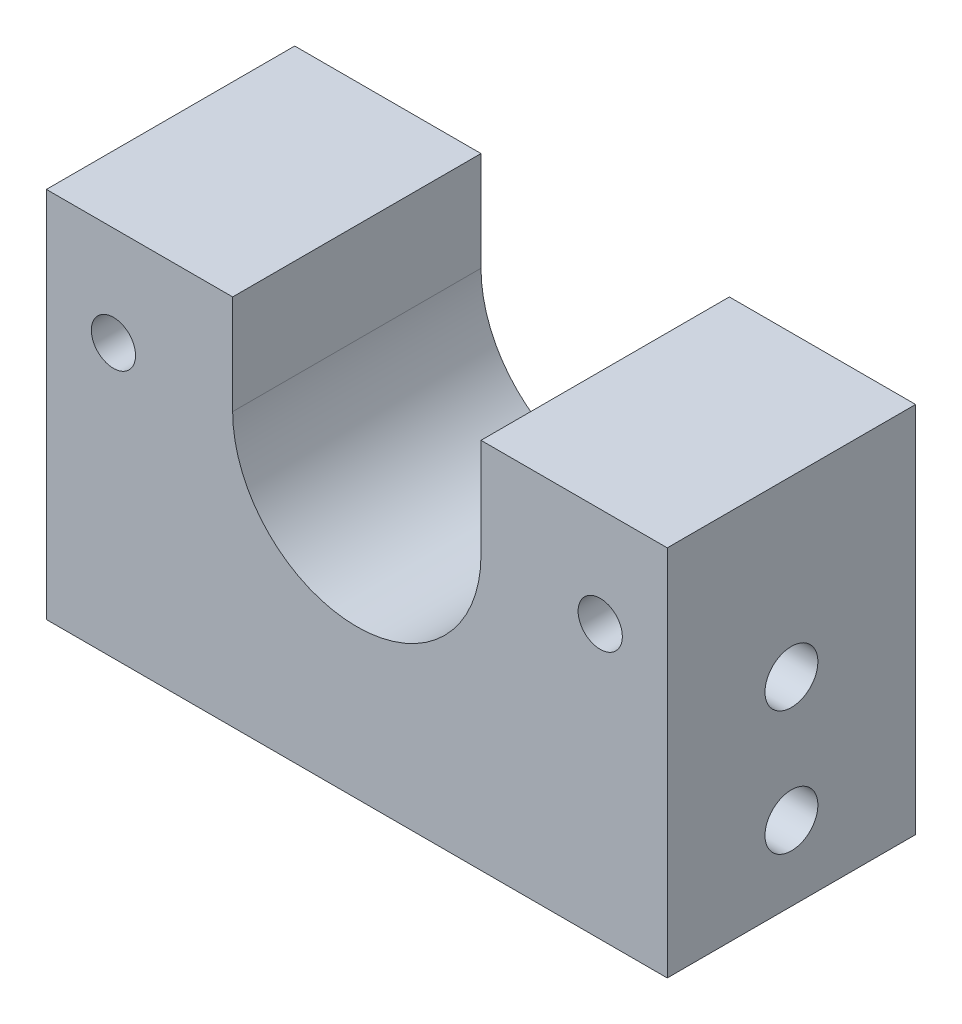
ISO-10303-21;
HEADER;
FILE_DESCRIPTION(('STEP AP214'),'2;1');
FILE_NAME('part.step','',(''),(''),'','','');
FILE_SCHEMA(('AUTOMOTIVE_DESIGN { 1 0 10303 214 1 1 1 1 }'));
ENDSEC;
DATA;
#1=APPLICATION_CONTEXT('core data for automotive mechanical design processes');
#2=APPLICATION_PROTOCOL_DEFINITION('international standard','automotive_design',2000,#1);
#3=PRODUCT_CONTEXT('',#1,'mechanical');
#4=PRODUCT('Part','Part','',(#3));
#5=PRODUCT_RELATED_PRODUCT_CATEGORY('part','',(#4));
#6=PRODUCT_DEFINITION_FORMATION('','',#4);
#7=PRODUCT_DEFINITION_CONTEXT('part definition',#1,'design');
#8=PRODUCT_DEFINITION('design','',#6,#7);
#9=PRODUCT_DEFINITION_SHAPE('','',#8);
#10=(LENGTH_UNIT() NAMED_UNIT(*) SI_UNIT(.MILLI.,.METRE.));
#11=(NAMED_UNIT(*) PLANE_ANGLE_UNIT() SI_UNIT($,.RADIAN.));
#12=(NAMED_UNIT(*) SI_UNIT($,.STERADIAN.) SOLID_ANGLE_UNIT());
#13=UNCERTAINTY_MEASURE_WITH_UNIT(LENGTH_MEASURE(1.E-05),#10,'distance_accuracy_value','');
#14=(GEOMETRIC_REPRESENTATION_CONTEXT(3) GLOBAL_UNCERTAINTY_ASSIGNED_CONTEXT((#13)) GLOBAL_UNIT_ASSIGNED_CONTEXT((#10,
#11,#12)) REPRESENTATION_CONTEXT('',''));
#15=CARTESIAN_POINT('',(0.,0.,0.));
#16=DIRECTION('',(0.,0.,1.));
#17=DIRECTION('',(1.,0.,0.));
#18=AXIS2_PLACEMENT_3D('',#15,#16,#17);
#19=CARTESIAN_POINT('',(-31.75,19.05,0.));
#20=DIRECTION('',(0.,1.,0.));
#21=DIRECTION('',(0.,0.,1.));
#22=AXIS2_PLACEMENT_3D('',#19,#20,#21);
#23=PLANE('',#22);
#24=DIRECTION('',(0.,0.,-1.));
#25=VECTOR('',#24,1.);
#26=CARTESIAN_POINT('',(-22.225,19.05,0.));
#27=LINE('',#26,#25);
#28=CARTESIAN_POINT('',(-22.225,19.05,0.));
#29=VERTEX_POINT('',#28);
#30=CARTESIAN_POINT('',(-22.225,19.05,-12.7));
#31=VERTEX_POINT('',#30);
#32=EDGE_CURVE('E163',#29,#31,#27,.T.);
#33=ORIENTED_EDGE('',*,*,#32,.T.);
#34=DIRECTION('',(1.,0.,0.));
#35=VECTOR('',#34,1.);
#36=CARTESIAN_POINT('',(-31.75,19.05,-12.7));
#37=LINE('',#36,#35);
#38=CARTESIAN_POINT('',(-31.75,19.05,-12.7));
#39=VERTEX_POINT('',#38);
#40=EDGE_CURVE('E193',#39,#31,#37,.T.);
#41=ORIENTED_EDGE('',*,*,#40,.F.);
#42=DIRECTION('',(0.,0.,1.));
#43=VECTOR('',#42,1.);
#44=CARTESIAN_POINT('',(-31.75,19.05,0.));
#45=LINE('',#44,#43);
#46=CARTESIAN_POINT('',(-31.75,19.05,0.));
#47=VERTEX_POINT('',#46);
#48=EDGE_CURVE('E180',#39,#47,#45,.T.);
#49=ORIENTED_EDGE('',*,*,#48,.T.);
#50=DIRECTION('',(1.,0.,0.));
#51=VECTOR('',#50,1.);
#52=CARTESIAN_POINT('',(-31.75,19.05,0.));
#53=LINE('',#52,#51);
#54=EDGE_CURVE('E11',#47,#29,#53,.T.);
#55=ORIENTED_EDGE('',*,*,#54,.T.);
#56=EDGE_LOOP('',(#33,#41,#49,#55));
#57=FACE_BOUND('',#56,.T.);
#58=ADVANCED_FACE('F35',(#57),#23,.T.);
#59=CARTESIAN_POINT('',(-31.75,0.,0.));
#60=DIRECTION('',(0.,0.,1.));
#61=DIRECTION('',(1.,0.,0.));
#62=AXIS2_PLACEMENT_3D('',#59,#60,#61);
#63=PLANE('',#62);
#64=CARTESIAN_POINT('',(-3.429,13.97,0.));
#65=DIRECTION('',(0.,0.,-1.));
#66=DIRECTION('',(-1.,0.,0.));
#67=AXIS2_PLACEMENT_3D('',#64,#65,#66);
#68=CIRCLE('',#67,1.1303);
#69=CARTESIAN_POINT('',(-4.5593,13.97,0.));
#70=VERTEX_POINT('',#69);
#71=EDGE_CURVE('E139',#70,#70,#68,.T.);
#72=ORIENTED_EDGE('',*,*,#71,.T.);
#73=EDGE_LOOP('',(#72));
#74=FACE_BOUND('',#73,.T.);
#75=CARTESIAN_POINT('',(-28.321,13.97,0.));
#76=DIRECTION('',(0.,0.,-1.));
#77=DIRECTION('',(-1.,0.,0.));
#78=AXIS2_PLACEMENT_3D('',#75,#76,#77);
#79=CIRCLE('',#78,1.1303);
#80=CARTESIAN_POINT('',(-29.4513,13.97,0.));
#81=VERTEX_POINT('',#80);
#82=EDGE_CURVE('E145',#81,#81,#79,.T.);
#83=ORIENTED_EDGE('',*,*,#82,.T.);
#84=EDGE_LOOP('',(#83));
#85=FACE_BOUND('',#84,.T.);
#86=DIRECTION('',(0.,1.,0.));
#87=VECTOR('',#86,1.);
#88=CARTESIAN_POINT('',(-22.225,19.05,0.));
#89=LINE('',#88,#87);
#90=CARTESIAN_POINT('',(-22.225,13.97,0.));
#91=VERTEX_POINT('',#90);
#92=EDGE_CURVE('E156',#91,#29,#89,.T.);
#93=ORIENTED_EDGE('',*,*,#92,.T.);
#94=ORIENTED_EDGE('',*,*,#54,.F.);
#95=DIRECTION('',(0.,-1.,0.));
#96=VECTOR('',#95,1.);
#97=CARTESIAN_POINT('',(-31.75,0.,0.));
#98=LINE('',#97,#96);
#99=CARTESIAN_POINT('',(-31.75,0.,0.));
#100=VERTEX_POINT('',#99);
#101=EDGE_CURVE('E172',#47,#100,#98,.T.);
#102=ORIENTED_EDGE('',*,*,#101,.T.);
#103=DIRECTION('',(1.,0.,0.));
#104=VECTOR('',#103,1.);
#105=CARTESIAN_POINT('',(-31.75,0.,0.));
#106=LINE('',#105,#104);
#107=CARTESIAN_POINT('',(0.,0.,0.));
#108=VERTEX_POINT('',#107);
#109=EDGE_CURVE('E39',#100,#108,#106,.T.);
#110=ORIENTED_EDGE('',*,*,#109,.T.);
#111=DIRECTION('',(0.,-1.,0.));
#112=VECTOR('',#111,1.);
#113=CARTESIAN_POINT('',(0.,0.,0.));
#114=LINE('',#113,#112);
#115=CARTESIAN_POINT('',(0.,19.05,0.));
#116=VERTEX_POINT('',#115);
#117=EDGE_CURVE('E166',#116,#108,#114,.T.);
#118=ORIENTED_EDGE('',*,*,#117,.F.);
#119=CARTESIAN_POINT('',(-9.525,19.05,0.));
#120=VERTEX_POINT('',#119);
#121=EDGE_CURVE('E44',#120,#116,#53,.T.);
#122=ORIENTED_EDGE('',*,*,#121,.F.);
#123=DIRECTION('',(0.,-1.,0.));
#124=VECTOR('',#123,1.);
#125=CARTESIAN_POINT('',(-9.525,19.05,0.));
#126=LINE('',#125,#124);
#127=CARTESIAN_POINT('',(-9.525,13.97,0.));
#128=VERTEX_POINT('',#127);
#129=EDGE_CURVE('E149',#120,#128,#126,.T.);
#130=ORIENTED_EDGE('',*,*,#129,.T.);
#131=CARTESIAN_POINT('',(-15.875,13.97,0.));
#132=DIRECTION('',(0.,0.,-1.));
#133=DIRECTION('',(-1.,0.,0.));
#134=AXIS2_PLACEMENT_3D('',#131,#132,#133);
#135=CIRCLE('',#134,6.35);
#136=EDGE_CURVE('E152',#128,#91,#135,.T.);
#137=ORIENTED_EDGE('',*,*,#136,.T.);
#138=EDGE_LOOP('',(#93,#94,#102,#110,#118,#122,#130,#137));
#139=FACE_BOUND('',#138,.T.);
#140=ADVANCED_FACE('F37',(#74,#85,#139),#63,.T.);
#141=DIRECTION('',(0.,0.,-1.));
#142=VECTOR('',#141,1.);
#143=CARTESIAN_POINT('',(-9.525,19.05,0.));
#144=LINE('',#143,#142);
#145=CARTESIAN_POINT('',(-9.525,19.05,-12.7));
#146=VERTEX_POINT('',#145);
#147=EDGE_CURVE('E52',#120,#146,#144,.T.);
#148=ORIENTED_EDGE('',*,*,#147,.F.);
#149=ORIENTED_EDGE('',*,*,#121,.T.);
#150=DIRECTION('',(0.,0.,1.));
#151=VECTOR('',#150,1.);
#152=CARTESIAN_POINT('',(0.,19.05,0.));
#153=LINE('',#152,#151);
#154=CARTESIAN_POINT('',(0.,19.05,-12.7));
#155=VERTEX_POINT('',#154);
#156=EDGE_CURVE('E175',#155,#116,#153,.T.);
#157=ORIENTED_EDGE('',*,*,#156,.F.);
#158=EDGE_CURVE('E195',#146,#155,#37,.T.);
#159=ORIENTED_EDGE('',*,*,#158,.F.);
#160=EDGE_LOOP('',(#148,#149,#157,#159));
#161=FACE_BOUND('',#160,.T.);
#162=ADVANCED_FACE('F202',(#161),#23,.T.);
#163=CARTESIAN_POINT('',(-31.75,0.,-12.7));
#164=DIRECTION('',(0.,0.,-1.));
#165=DIRECTION('',(-1.,0.,0.));
#166=AXIS2_PLACEMENT_3D('',#163,#164,#165);
#167=PLANE('',#166);
#168=CARTESIAN_POINT('',(-3.429,13.97,-12.7));
#169=DIRECTION('',(0.,0.,-1.));
#170=DIRECTION('',(-1.,0.,0.));
#171=AXIS2_PLACEMENT_3D('',#168,#169,#170);
#172=CIRCLE('',#171,1.1303);
#173=CARTESIAN_POINT('',(-4.5593,13.97,-12.7));
#174=VERTEX_POINT('',#173);
#175=EDGE_CURVE('E136',#174,#174,#172,.T.);
#176=ORIENTED_EDGE('',*,*,#175,.F.);
#177=EDGE_LOOP('',(#176));
#178=FACE_BOUND('',#177,.T.);
#179=CARTESIAN_POINT('',(-28.321,13.97,-12.7));
#180=DIRECTION('',(0.,0.,-1.));
#181=DIRECTION('',(-1.,0.,0.));
#182=AXIS2_PLACEMENT_3D('',#179,#180,#181);
#183=CIRCLE('',#182,1.1303);
#184=CARTESIAN_POINT('',(-29.4513,13.97,-12.7));
#185=VERTEX_POINT('',#184);
#186=EDGE_CURVE('E142',#185,#185,#183,.T.);
#187=ORIENTED_EDGE('',*,*,#186,.F.);
#188=EDGE_LOOP('',(#187));
#189=FACE_BOUND('',#188,.T.);
#190=DIRECTION('',(0.,1.,0.));
#191=VECTOR('',#190,1.);
#192=CARTESIAN_POINT('',(-22.225,19.05,-12.7));
#193=LINE('',#192,#191);
#194=CARTESIAN_POINT('',(-22.225,13.97,-12.7));
#195=VERTEX_POINT('',#194);
#196=EDGE_CURVE('E153',#195,#31,#193,.T.);
#197=ORIENTED_EDGE('',*,*,#196,.F.);
#198=CARTESIAN_POINT('',(-15.875,13.97,-12.7));
#199=DIRECTION('',(0.,0.,-1.));
#200=DIRECTION('',(-1.,0.,0.));
#201=AXIS2_PLACEMENT_3D('',#198,#199,#200);
#202=CIRCLE('',#201,6.35);
#203=CARTESIAN_POINT('',(-9.525,13.97,-12.7));
#204=VERTEX_POINT('',#203);
#205=EDGE_CURVE('E159',#204,#195,#202,.T.);
#206=ORIENTED_EDGE('',*,*,#205,.F.);
#207=DIRECTION('',(0.,-1.,0.));
#208=VECTOR('',#207,1.);
#209=CARTESIAN_POINT('',(-9.525,19.05,-12.7));
#210=LINE('',#209,#208);
#211=EDGE_CURVE('E148',#146,#204,#210,.T.);
#212=ORIENTED_EDGE('',*,*,#211,.F.);
#213=ORIENTED_EDGE('',*,*,#158,.T.);
#214=DIRECTION('',(0.,1.,0.));
#215=VECTOR('',#214,1.);
#216=CARTESIAN_POINT('',(0.,0.,-12.7));
#217=LINE('',#216,#215);
#218=CARTESIAN_POINT('',(0.,0.,-12.7));
#219=VERTEX_POINT('',#218);
#220=EDGE_CURVE('E188',#219,#155,#217,.T.);
#221=ORIENTED_EDGE('',*,*,#220,.F.);
#222=DIRECTION('',(1.,0.,0.));
#223=VECTOR('',#222,1.);
#224=CARTESIAN_POINT('',(-31.75,0.,-12.7));
#225=LINE('',#224,#223);
#226=CARTESIAN_POINT('',(-31.75,0.,-12.7));
#227=VERTEX_POINT('',#226);
#228=EDGE_CURVE('E196',#227,#219,#225,.T.);
#229=ORIENTED_EDGE('',*,*,#228,.F.);
#230=DIRECTION('',(0.,1.,0.));
#231=VECTOR('',#230,1.);
#232=CARTESIAN_POINT('',(-31.75,0.,-12.7));
#233=LINE('',#232,#231);
#234=EDGE_CURVE('E177',#227,#39,#233,.T.);
#235=ORIENTED_EDGE('',*,*,#234,.T.);
#236=ORIENTED_EDGE('',*,*,#40,.T.);
#237=EDGE_LOOP('',(#197,#206,#212,#213,#221,#229,#235,#236));
#238=FACE_BOUND('',#237,.T.);
#239=ADVANCED_FACE('F205',(#178,#189,#238),#167,.T.);
#240=CARTESIAN_POINT('',(-31.75,0.,0.));
#241=DIRECTION('',(0.,-1.,0.));
#242=DIRECTION('',(0.,0.,-1.));
#243=AXIS2_PLACEMENT_3D('',#240,#241,#242);
#244=PLANE('',#243);
#245=DIRECTION('',(0.,0.,-1.));
#246=VECTOR('',#245,1.);
#247=CARTESIAN_POINT('',(0.,0.,0.));
#248=LINE('',#247,#246);
#249=EDGE_CURVE('E185',#108,#219,#248,.T.);
#250=ORIENTED_EDGE('',*,*,#249,.F.);
#251=ORIENTED_EDGE('',*,*,#109,.F.);
#252=DIRECTION('',(0.,0.,-1.));
#253=VECTOR('',#252,1.);
#254=CARTESIAN_POINT('',(-31.75,0.,0.));
#255=LINE('',#254,#253);
#256=EDGE_CURVE('E174',#100,#227,#255,.T.);
#257=ORIENTED_EDGE('',*,*,#256,.T.);
#258=ORIENTED_EDGE('',*,*,#228,.T.);
#259=EDGE_LOOP('',(#250,#251,#257,#258));
#260=FACE_BOUND('',#259,.T.);
#261=ADVANCED_FACE('F198',(#260),#244,.T.);
#262=CARTESIAN_POINT('',(-31.75,0.,0.));
#263=DIRECTION('',(-1.,0.,0.));
#264=DIRECTION('',(0.,0.,1.));
#265=AXIS2_PLACEMENT_3D('',#262,#263,#264);
#266=PLANE('',#265);
#267=ORIENTED_EDGE('',*,*,#101,.F.);
#268=ORIENTED_EDGE('',*,*,#48,.F.);
#269=ORIENTED_EDGE('',*,*,#234,.F.);
#270=ORIENTED_EDGE('',*,*,#256,.F.);
#271=EDGE_LOOP('',(#267,#268,#269,#270));
#272=FACE_BOUND('',#271,.T.);
#273=ADVANCED_FACE('F217',(#272),#266,.T.);
#274=CARTESIAN_POINT('',(0.,0.,0.));
#275=DIRECTION('',(-1.,0.,0.));
#276=DIRECTION('',(0.,0.,1.));
#277=AXIS2_PLACEMENT_3D('',#274,#275,#276);
#278=PLANE('',#277);
#279=CARTESIAN_POINT('',(0.,3.81,-6.35));
#280=DIRECTION('',(1.,0.,0.));
#281=DIRECTION('',(0.,0.,-1.));
#282=AXIS2_PLACEMENT_3D('',#279,#280,#281);
#283=CIRCLE('',#282,1.35254999999999);
#284=CARTESIAN_POINT('',(0.,3.81,-7.70254999999999));
#285=VERTEX_POINT('',#284);
#286=EDGE_CURVE('E126',#285,#285,#283,.T.);
#287=ORIENTED_EDGE('',*,*,#286,.F.);
#288=EDGE_LOOP('',(#287));
#289=FACE_BOUND('',#288,.T.);
#290=CARTESIAN_POINT('',(0.,10.16,-6.35));
#291=DIRECTION('',(1.,0.,0.));
#292=DIRECTION('',(0.,0.,-1.));
#293=AXIS2_PLACEMENT_3D('',#290,#291,#292);
#294=CIRCLE('',#293,1.35254999999999);
#295=CARTESIAN_POINT('',(0.,10.16,-7.70254999999999));
#296=VERTEX_POINT('',#295);
#297=EDGE_CURVE('E125',#296,#296,#294,.T.);
#298=ORIENTED_EDGE('',*,*,#297,.F.);
#299=EDGE_LOOP('',(#298));
#300=FACE_BOUND('',#299,.T.);
#301=ORIENTED_EDGE('',*,*,#117,.T.);
#302=ORIENTED_EDGE('',*,*,#249,.T.);
#303=ORIENTED_EDGE('',*,*,#220,.T.);
#304=ORIENTED_EDGE('',*,*,#156,.T.);
#305=EDGE_LOOP('',(#301,#302,#303,#304));
#306=FACE_BOUND('',#305,.T.);
#307=ADVANCED_FACE('F200',(#289,#300,#306),#278,.F.);
#308=CARTESIAN_POINT('',(-22.225,19.05,0.));
#309=DIRECTION('',(-1.,0.,0.));
#310=DIRECTION('',(0.,0.,1.));
#311=AXIS2_PLACEMENT_3D('',#308,#309,#310);
#312=PLANE('',#311);
#313=ORIENTED_EDGE('',*,*,#196,.T.);
#314=ORIENTED_EDGE('',*,*,#32,.F.);
#315=ORIENTED_EDGE('',*,*,#92,.F.);
#316=DIRECTION('',(0.,0.,-1.));
#317=VECTOR('',#316,1.);
#318=CARTESIAN_POINT('',(-22.225,13.97,0.));
#319=LINE('',#318,#317);
#320=EDGE_CURVE('E167',#91,#195,#319,.T.);
#321=ORIENTED_EDGE('',*,*,#320,.T.);
#322=EDGE_LOOP('',(#313,#314,#315,#321));
#323=FACE_BOUND('',#322,.T.);
#324=ADVANCED_FACE('F218',(#323),#312,.F.);
#325=CARTESIAN_POINT('',(-15.875,13.97,0.));
#326=DIRECTION('',(0.,0.,-1.));
#327=DIRECTION('',(-1.,0.,0.));
#328=AXIS2_PLACEMENT_3D('',#325,#326,#327);
#329=CYLINDRICAL_SURFACE('',#328,6.35);
#330=ORIENTED_EDGE('',*,*,#205,.T.);
#331=ORIENTED_EDGE('',*,*,#320,.F.);
#332=ORIENTED_EDGE('',*,*,#136,.F.);
#333=DIRECTION('',(0.,0.,-1.));
#334=VECTOR('',#333,1.);
#335=CARTESIAN_POINT('',(-9.525,13.97,0.));
#336=LINE('',#335,#334);
#337=EDGE_CURVE('E169',#128,#204,#336,.T.);
#338=ORIENTED_EDGE('',*,*,#337,.T.);
#339=EDGE_LOOP('',(#330,#331,#332,#338));
#340=FACE_BOUND('',#339,.T.);
#341=ADVANCED_FACE('F210',(#340),#329,.F.);
#342=CARTESIAN_POINT('',(-9.525,19.05,0.));
#343=DIRECTION('',(1.,0.,0.));
#344=DIRECTION('',(0.,1.,0.));
#345=AXIS2_PLACEMENT_3D('',#342,#343,#344);
#346=PLANE('',#345);
#347=ORIENTED_EDGE('',*,*,#211,.T.);
#348=ORIENTED_EDGE('',*,*,#337,.F.);
#349=ORIENTED_EDGE('',*,*,#129,.F.);
#350=ORIENTED_EDGE('',*,*,#147,.T.);
#351=EDGE_LOOP('',(#347,#348,#349,#350));
#352=FACE_BOUND('',#351,.T.);
#353=ADVANCED_FACE('F207',(#352),#346,.F.);
#354=CARTESIAN_POINT('',(-28.321,13.97,-12.7));
#355=DIRECTION('',(0.,0.,-1.));
#356=DIRECTION('',(-1.,0.,0.));
#357=AXIS2_PLACEMENT_3D('',#354,#355,#356);
#358=CYLINDRICAL_SURFACE('',#357,1.1303);
#359=ORIENTED_EDGE('',*,*,#82,.F.);
#360=EDGE_LOOP('',(#359));
#361=FACE_BOUND('',#360,.T.);
#362=ORIENTED_EDGE('',*,*,#186,.T.);
#363=EDGE_LOOP('',(#362));
#364=FACE_BOUND('',#363,.T.);
#365=ADVANCED_FACE('F248',(#361,#364),#358,.F.);
#366=CARTESIAN_POINT('',(-3.429,13.97,-12.7));
#367=DIRECTION('',(0.,0.,-1.));
#368=DIRECTION('',(-1.,0.,0.));
#369=AXIS2_PLACEMENT_3D('',#366,#367,#368);
#370=CYLINDRICAL_SURFACE('',#369,1.1303);
#371=ORIENTED_EDGE('',*,*,#71,.F.);
#372=EDGE_LOOP('',(#371));
#373=FACE_BOUND('',#372,.T.);
#374=ORIENTED_EDGE('',*,*,#175,.T.);
#375=EDGE_LOOP('',(#374));
#376=FACE_BOUND('',#375,.T.);
#377=ADVANCED_FACE('F250',(#373,#376),#370,.F.);
#378=CARTESIAN_POINT('',(-8.382,10.16,-6.35));
#379=DIRECTION('',(1.,0.,0.));
#380=DIRECTION('',(0.,0.,-1.));
#381=AXIS2_PLACEMENT_3D('',#378,#379,#380);
#382=CONICAL_SURFACE('',#381,1.35255,1.02974425867665);
#383=CARTESIAN_POINT('',(-9.19469403026573,10.16,-6.35));
#384=VERTEX_POINT('',#383);
#385=VERTEX_LOOP('',#384);
#386=FACE_BOUND('',#385,.T.);
#387=CARTESIAN_POINT('',(-8.382,10.16,-6.35));
#388=DIRECTION('',(1.,0.,0.));
#389=DIRECTION('',(0.,0.,-1.));
#390=AXIS2_PLACEMENT_3D('',#387,#388,#389);
#391=CIRCLE('',#390,1.35255);
#392=CARTESIAN_POINT('',(-8.382,10.16,-7.70255));
#393=VERTEX_POINT('',#392);
#394=EDGE_CURVE('E129',#393,#393,#391,.T.);
#395=ORIENTED_EDGE('',*,*,#394,.T.);
#396=EDGE_LOOP('',(#395));
#397=FACE_BOUND('',#396,.T.);
#398=ADVANCED_FACE('F256',(#386,#397),#382,.F.);
#399=CARTESIAN_POINT('',(0.,10.16,-6.35));
#400=DIRECTION('',(1.,0.,0.));
#401=DIRECTION('',(0.,0.,-1.));
#402=AXIS2_PLACEMENT_3D('',#399,#400,#401);
#403=CYLINDRICAL_SURFACE('',#402,1.35254999999999);
#404=ORIENTED_EDGE('',*,*,#394,.F.);
#405=EDGE_LOOP('',(#404));
#406=FACE_BOUND('',#405,.T.);
#407=ORIENTED_EDGE('',*,*,#297,.T.);
#408=EDGE_LOOP('',(#407));
#409=FACE_BOUND('',#408,.T.);
#410=ADVANCED_FACE('F119',(#406,#409),#403,.F.);
#411=CARTESIAN_POINT('',(-8.382,3.81,-6.35));
#412=DIRECTION('',(1.,0.,0.));
#413=DIRECTION('',(0.,0.,-1.));
#414=AXIS2_PLACEMENT_3D('',#411,#412,#413);
#415=CONICAL_SURFACE('',#414,1.35255,1.02974425867665);
#416=CARTESIAN_POINT('',(-9.19469403026573,3.81,-6.35));
#417=VERTEX_POINT('',#416);
#418=VERTEX_LOOP('',#417);
#419=FACE_BOUND('',#418,.T.);
#420=CARTESIAN_POINT('',(-8.382,3.81,-6.35));
#421=DIRECTION('',(1.,0.,0.));
#422=DIRECTION('',(0.,0.,-1.));
#423=AXIS2_PLACEMENT_3D('',#420,#421,#422);
#424=CIRCLE('',#423,1.35255);
#425=CARTESIAN_POINT('',(-8.382,3.81,-7.70255));
#426=VERTEX_POINT('',#425);
#427=EDGE_CURVE('E123',#426,#426,#424,.T.);
#428=ORIENTED_EDGE('',*,*,#427,.T.);
#429=EDGE_LOOP('',(#428));
#430=FACE_BOUND('',#429,.T.);
#431=ADVANCED_FACE('F115',(#419,#430),#415,.F.);
#432=CARTESIAN_POINT('',(0.,3.81,-6.35));
#433=DIRECTION('',(1.,0.,0.));
#434=DIRECTION('',(0.,0.,-1.));
#435=AXIS2_PLACEMENT_3D('',#432,#433,#434);
#436=CYLINDRICAL_SURFACE('',#435,1.35254999999999);
#437=ORIENTED_EDGE('',*,*,#427,.F.);
#438=EDGE_LOOP('',(#437));
#439=FACE_BOUND('',#438,.T.);
#440=ORIENTED_EDGE('',*,*,#286,.T.);
#441=EDGE_LOOP('',(#440));
#442=FACE_BOUND('',#441,.T.);
#443=ADVANCED_FACE('F118',(#439,#442),#436,.F.);
#444=CLOSED_SHELL('',(#58,#140,#162,#239,#261,#273,#307,#324,#341,#353,#365,#377,#398,#410,#431,#443));
#445=MANIFOLD_SOLID_BREP('B2',#444);
#446=ADVANCED_BREP_SHAPE_REPRESENTATION('',(#18,#445),#14);
#447=SHAPE_DEFINITION_REPRESENTATION(#9,#446);
ENDSEC;
END-ISO-10303-21;
